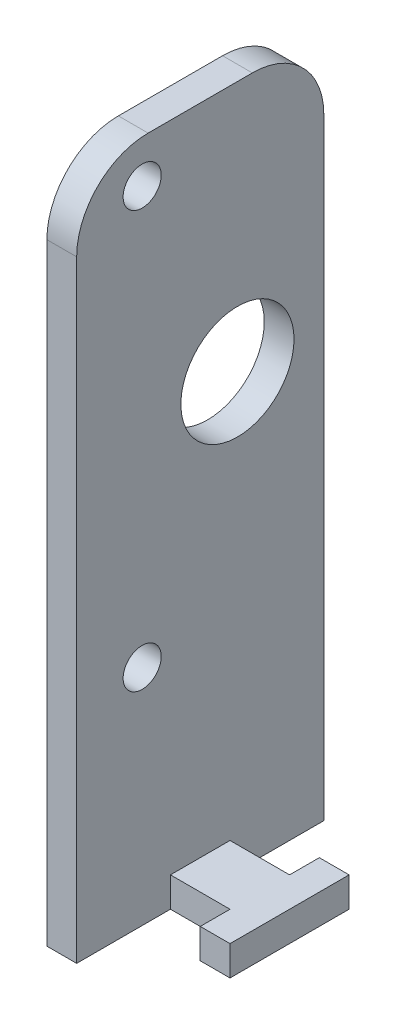
ISO-10303-21;
HEADER;
FILE_DESCRIPTION(('STEP AP214'),'2;1');
FILE_NAME('part.step','',(''),(''),'','','');
FILE_SCHEMA(('AUTOMOTIVE_DESIGN { 1 0 10303 214 1 1 1 1 }'));
ENDSEC;
DATA;
#1=APPLICATION_CONTEXT('core data for automotive mechanical design processes');
#2=APPLICATION_PROTOCOL_DEFINITION('international standard','automotive_design',2000,#1);
#3=PRODUCT_CONTEXT('',#1,'mechanical');
#4=PRODUCT('Part','Part','',(#3));
#5=PRODUCT_RELATED_PRODUCT_CATEGORY('part','',(#4));
#6=PRODUCT_DEFINITION_FORMATION('','',#4);
#7=PRODUCT_DEFINITION_CONTEXT('part definition',#1,'design');
#8=PRODUCT_DEFINITION('design','',#6,#7);
#9=PRODUCT_DEFINITION_SHAPE('','',#8);
#10=(LENGTH_UNIT() NAMED_UNIT(*) SI_UNIT(.MILLI.,.METRE.));
#11=(NAMED_UNIT(*) PLANE_ANGLE_UNIT() SI_UNIT($,.RADIAN.));
#12=(NAMED_UNIT(*) SI_UNIT($,.STERADIAN.) SOLID_ANGLE_UNIT());
#13=UNCERTAINTY_MEASURE_WITH_UNIT(LENGTH_MEASURE(1.E-05),#10,'distance_accuracy_value','');
#14=(GEOMETRIC_REPRESENTATION_CONTEXT(3) GLOBAL_UNCERTAINTY_ASSIGNED_CONTEXT((#13)) GLOBAL_UNIT_ASSIGNED_CONTEXT((#10,
#11,#12)) REPRESENTATION_CONTEXT('',''));
#15=CARTESIAN_POINT('',(0.,0.,0.));
#16=DIRECTION('',(0.,0.,1.));
#17=DIRECTION('',(1.,0.,0.));
#18=AXIS2_PLACEMENT_3D('',#15,#16,#17);
#19=CARTESIAN_POINT('',(0.,2.5,0.));
#20=DIRECTION('',(0.,-1.,0.));
#21=DIRECTION('',(0.,0.,-1.));
#22=AXIS2_PLACEMENT_3D('',#19,#20,#21);
#23=PLANE('',#22);
#24=DIRECTION('',(1.,0.,0.));
#25=VECTOR('',#24,1.);
#26=CARTESIAN_POINT('',(0.,2.5,29.625));
#27=LINE('',#26,#25);
#28=CARTESIAN_POINT('',(-24.175,2.5,29.625));
#29=VERTEX_POINT('',#28);
#30=CARTESIAN_POINT('',(-19.175,2.5,29.625));
#31=VERTEX_POINT('',#30);
#32=EDGE_CURVE('E173',#29,#31,#27,.T.);
#33=ORIENTED_EDGE('',*,*,#32,.T.);
#34=DIRECTION('',(0.,0.,1.));
#35=VECTOR('',#34,1.);
#36=CARTESIAN_POINT('',(-19.1750000000001,2.5,0.));
#37=LINE('',#36,#35);
#38=CARTESIAN_POINT('',(-19.175,2.5,32.125));
#39=VERTEX_POINT('',#38);
#40=EDGE_CURVE('E170',#31,#39,#37,.T.);
#41=ORIENTED_EDGE('',*,*,#40,.T.);
#42=DIRECTION('',(-1.,0.,0.));
#43=VECTOR('',#42,1.);
#44=CARTESIAN_POINT('',(0.,2.5,32.125));
#45=LINE('',#44,#43);
#46=CARTESIAN_POINT('',(-16.675,2.5,32.125));
#47=VERTEX_POINT('',#46);
#48=EDGE_CURVE('E163',#47,#39,#45,.T.);
#49=ORIENTED_EDGE('',*,*,#48,.F.);
#50=DIRECTION('',(0.,0.,1.));
#51=VECTOR('',#50,1.);
#52=CARTESIAN_POINT('',(-16.675,2.5,0.));
#53=LINE('',#52,#51);
#54=CARTESIAN_POINT('',(-16.675,2.5,22.125));
#55=VERTEX_POINT('',#54);
#56=EDGE_CURVE('E153',#55,#47,#53,.T.);
#57=ORIENTED_EDGE('',*,*,#56,.F.);
#58=DIRECTION('',(1.,0.,0.));
#59=VECTOR('',#58,1.);
#60=CARTESIAN_POINT('',(0.,2.5,22.125));
#61=LINE('',#60,#59);
#62=CARTESIAN_POINT('',(-19.175,2.5,22.125));
#63=VERTEX_POINT('',#62);
#64=EDGE_CURVE('E155',#63,#55,#61,.T.);
#65=ORIENTED_EDGE('',*,*,#64,.F.);
#66=DIRECTION('',(0.,0.,-1.));
#67=VECTOR('',#66,1.);
#68=CARTESIAN_POINT('',(-19.1749999999999,2.5,0.));
#69=LINE('',#68,#67);
#70=CARTESIAN_POINT('',(-19.175,2.5,24.625));
#71=VERTEX_POINT('',#70);
#72=EDGE_CURVE('E179',#71,#63,#69,.T.);
#73=ORIENTED_EDGE('',*,*,#72,.F.);
#74=DIRECTION('',(1.,0.,0.));
#75=VECTOR('',#74,1.);
#76=CARTESIAN_POINT('',(0.,2.5,24.625));
#77=LINE('',#76,#75);
#78=CARTESIAN_POINT('',(-24.175,2.5,24.625));
#79=VERTEX_POINT('',#78);
#80=EDGE_CURVE('E176',#79,#71,#77,.T.);
#81=ORIENTED_EDGE('',*,*,#80,.F.);
#82=DIRECTION('',(0.,0.,-1.));
#83=VECTOR('',#82,1.);
#84=CARTESIAN_POINT('',(-24.175,2.5,37.5));
#85=LINE('',#84,#83);
#86=EDGE_CURVE('E223',#29,#79,#85,.T.);
#87=ORIENTED_EDGE('',*,*,#86,.F.);
#88=EDGE_LOOP('',(#33,#41,#49,#57,#65,#73,#81,#87));
#89=FACE_BOUND('',#88,.T.);
#90=ADVANCED_FACE('F34',(#89),#23,.F.);
#91=CARTESIAN_POINT('',(0.,0.,0.));
#92=DIRECTION('',(0.,-1.,0.));
#93=DIRECTION('',(0.,0.,-1.));
#94=AXIS2_PLACEMENT_3D('',#91,#92,#93);
#95=PLANE('',#94);
#96=DIRECTION('',(0.,0.,1.));
#97=VECTOR('',#96,1.);
#98=CARTESIAN_POINT('',(-24.175,0.,0.));
#99=LINE('',#98,#97);
#100=CARTESIAN_POINT('',(-24.175,0.,29.625));
#101=VERTEX_POINT('',#100);
#102=CARTESIAN_POINT('',(-24.175,0.,37.5));
#103=VERTEX_POINT('',#102);
#104=EDGE_CURVE('E272',#101,#103,#99,.T.);
#105=ORIENTED_EDGE('',*,*,#104,.T.);
#106=DIRECTION('',(1.,0.,0.));
#107=VECTOR('',#106,1.);
#108=CARTESIAN_POINT('',(-40.,0.,37.5));
#109=LINE('',#108,#107);
#110=CARTESIAN_POINT('',(-26.675,0.,37.5));
#111=VERTEX_POINT('',#110);
#112=EDGE_CURVE('E231',#111,#103,#109,.T.);
#113=ORIENTED_EDGE('',*,*,#112,.F.);
#114=DIRECTION('',(0.,0.,-1.));
#115=VECTOR('',#114,1.);
#116=CARTESIAN_POINT('',(-26.675,0.,-20.));
#117=LINE('',#116,#115);
#118=CARTESIAN_POINT('',(-26.675,0.,16.75));
#119=VERTEX_POINT('',#118);
#120=EDGE_CURVE('E145',#111,#119,#117,.T.);
#121=ORIENTED_EDGE('',*,*,#120,.T.);
#122=DIRECTION('',(1.,0.,0.));
#123=VECTOR('',#122,1.);
#124=CARTESIAN_POINT('',(0.,0.,16.75));
#125=LINE('',#124,#123);
#126=CARTESIAN_POINT('',(-24.175,0.,16.75));
#127=VERTEX_POINT('',#126);
#128=EDGE_CURVE('E258',#119,#127,#125,.T.);
#129=ORIENTED_EDGE('',*,*,#128,.T.);
#130=DIRECTION('',(0.,0.,1.));
#131=VECTOR('',#130,1.);
#132=CARTESIAN_POINT('',(-24.175,0.,0.));
#133=LINE('',#132,#131);
#134=CARTESIAN_POINT('',(-24.175,0.,24.625));
#135=VERTEX_POINT('',#134);
#136=EDGE_CURVE('E276',#127,#135,#133,.T.);
#137=ORIENTED_EDGE('',*,*,#136,.T.);
#138=DIRECTION('',(1.,0.,0.));
#139=VECTOR('',#138,1.);
#140=CARTESIAN_POINT('',(0.,0.,24.625));
#141=LINE('',#140,#139);
#142=CARTESIAN_POINT('',(-19.175,0.,24.625));
#143=VERTEX_POINT('',#142);
#144=EDGE_CURVE('E284',#135,#143,#141,.T.);
#145=ORIENTED_EDGE('',*,*,#144,.T.);
#146=DIRECTION('',(0.,0.,-1.));
#147=VECTOR('',#146,1.);
#148=CARTESIAN_POINT('',(-19.1749999999999,0.,0.));
#149=LINE('',#148,#147);
#150=CARTESIAN_POINT('',(-19.175,0.,22.125));
#151=VERTEX_POINT('',#150);
#152=EDGE_CURVE('E165',#143,#151,#149,.T.);
#153=ORIENTED_EDGE('',*,*,#152,.T.);
#154=DIRECTION('',(1.,0.,0.));
#155=VECTOR('',#154,1.);
#156=CARTESIAN_POINT('',(0.,0.,22.125));
#157=LINE('',#156,#155);
#158=CARTESIAN_POINT('',(-16.675,0.,22.125));
#159=VERTEX_POINT('',#158);
#160=EDGE_CURVE('E161',#151,#159,#157,.T.);
#161=ORIENTED_EDGE('',*,*,#160,.T.);
#162=DIRECTION('',(0.,0.,1.));
#163=VECTOR('',#162,1.);
#164=CARTESIAN_POINT('',(-16.675,0.,0.));
#165=LINE('',#164,#163);
#166=CARTESIAN_POINT('',(-16.675,0.,32.125));
#167=VERTEX_POINT('',#166);
#168=EDGE_CURVE('E150',#159,#167,#165,.T.);
#169=ORIENTED_EDGE('',*,*,#168,.T.);
#170=DIRECTION('',(-1.,0.,0.));
#171=VECTOR('',#170,1.);
#172=CARTESIAN_POINT('',(0.,0.,32.125));
#173=LINE('',#172,#171);
#174=CARTESIAN_POINT('',(-19.175,0.,32.125));
#175=VERTEX_POINT('',#174);
#176=EDGE_CURVE('E135',#167,#175,#173,.T.);
#177=ORIENTED_EDGE('',*,*,#176,.T.);
#178=DIRECTION('',(0.,0.,1.));
#179=VECTOR('',#178,1.);
#180=CARTESIAN_POINT('',(-19.1750000000001,0.,0.));
#181=LINE('',#180,#179);
#182=CARTESIAN_POINT('',(-19.175,0.,29.625));
#183=VERTEX_POINT('',#182);
#184=EDGE_CURVE('E278',#183,#175,#181,.T.);
#185=ORIENTED_EDGE('',*,*,#184,.F.);
#186=DIRECTION('',(1.,0.,0.));
#187=VECTOR('',#186,1.);
#188=CARTESIAN_POINT('',(0.,0.,29.625));
#189=LINE('',#188,#187);
#190=EDGE_CURVE('E273',#101,#183,#189,.T.);
#191=ORIENTED_EDGE('',*,*,#190,.F.);
#192=EDGE_LOOP('',(#105,#113,#121,#129,#137,#145,#153,#161,#169,#177,#185,#191));
#193=FACE_BOUND('',#192,.T.);
#194=ADVANCED_FACE('F159',(#193),#95,.T.);
#195=CARTESIAN_POINT('',(0.,0.,37.5));
#196=DIRECTION('',(0.,0.,1.));
#197=DIRECTION('',(1.,0.,0.));
#198=AXIS2_PLACEMENT_3D('',#195,#196,#197);
#199=PLANE('',#198);
#200=ORIENTED_EDGE('',*,*,#112,.T.);
#201=DIRECTION('',(0.,-1.,0.));
#202=VECTOR('',#201,1.);
#203=CARTESIAN_POINT('',(-24.175,97.9000598085269,37.5));
#204=LINE('',#203,#202);
#205=CARTESIAN_POINT('',(-24.175,51.375,37.5));
#206=VERTEX_POINT('',#205);
#207=EDGE_CURVE('E227',#206,#103,#204,.T.);
#208=ORIENTED_EDGE('',*,*,#207,.F.);
#209=DIRECTION('',(1.,0.,0.));
#210=VECTOR('',#209,1.);
#211=CARTESIAN_POINT('',(-26.675,51.375,37.5));
#212=LINE('',#211,#210);
#213=CARTESIAN_POINT('',(-26.675,51.375,37.5));
#214=VERTEX_POINT('',#213);
#215=EDGE_CURVE('E11',#206,#214,#212,.F.);
#216=ORIENTED_EDGE('',*,*,#215,.T.);
#217=DIRECTION('',(0.,-1.,0.));
#218=VECTOR('',#217,1.);
#219=CARTESIAN_POINT('',(-26.675,97.9000598085269,37.5));
#220=LINE('',#219,#218);
#221=EDGE_CURVE('E212',#214,#111,#220,.T.);
#222=ORIENTED_EDGE('',*,*,#221,.T.);
#223=EDGE_LOOP('',(#200,#208,#216,#222));
#224=FACE_BOUND('',#223,.T.);
#225=ADVANCED_FACE('F269',(#224),#199,.T.);
#226=CARTESIAN_POINT('',(-24.175,97.9000598085269,37.5));
#227=DIRECTION('',(-1.,0.,0.));
#228=DIRECTION('',(0.,0.,1.));
#229=AXIS2_PLACEMENT_3D('',#226,#227,#228);
#230=PLANE('',#229);
#231=CARTESIAN_POINT('',(-24.175,36.275,24.));
#232=DIRECTION('',(1.,0.,0.));
#233=DIRECTION('',(0.,0.,-1.));
#234=AXIS2_PLACEMENT_3D('',#231,#232,#233);
#235=CIRCLE('',#234,4.75);
#236=CARTESIAN_POINT('',(-24.175,36.275,19.25));
#237=VERTEX_POINT('',#236);
#238=EDGE_CURVE('E205',#237,#237,#235,.T.);
#239=ORIENTED_EDGE('',*,*,#238,.F.);
#240=EDGE_LOOP('',(#239));
#241=FACE_BOUND('',#240,.T.);
#242=CARTESIAN_POINT('',(-24.175,18.775,32.));
#243=DIRECTION('',(1.,0.,0.));
#244=DIRECTION('',(0.,0.,-1.));
#245=AXIS2_PLACEMENT_3D('',#242,#243,#244);
#246=CIRCLE('',#245,1.6);
#247=CARTESIAN_POINT('',(-24.175,18.775,30.4));
#248=VERTEX_POINT('',#247);
#249=EDGE_CURVE('E209',#248,#248,#246,.T.);
#250=ORIENTED_EDGE('',*,*,#249,.F.);
#251=EDGE_LOOP('',(#250));
#252=FACE_BOUND('',#251,.T.);
#253=CARTESIAN_POINT('',(-24.175,53.775,32.));
#254=DIRECTION('',(1.,0.,0.));
#255=DIRECTION('',(0.,0.,-1.));
#256=AXIS2_PLACEMENT_3D('',#253,#254,#255);
#257=CIRCLE('',#256,1.6);
#258=CARTESIAN_POINT('',(-24.175,53.775,30.4));
#259=VERTEX_POINT('',#258);
#260=EDGE_CURVE('E216',#259,#259,#257,.T.);
#261=ORIENTED_EDGE('',*,*,#260,.F.);
#262=EDGE_LOOP('',(#261));
#263=FACE_BOUND('',#262,.T.);
#264=DIRECTION('',(0.,-1.,0.));
#265=VECTOR('',#264,1.);
#266=CARTESIAN_POINT('',(-24.175,97.9000598085269,16.75));
#267=LINE('',#266,#265);
#268=CARTESIAN_POINT('',(-24.175,51.375,16.75));
#269=VERTEX_POINT('',#268);
#270=EDGE_CURVE('E226',#269,#127,#267,.T.);
#271=ORIENTED_EDGE('',*,*,#270,.F.);
#272=CARTESIAN_POINT('',(-24.175,51.375,22.75));
#273=DIRECTION('',(-1.,0.,0.));
#274=DIRECTION('',(0.,0.,1.));
#275=AXIS2_PLACEMENT_3D('',#272,#273,#274);
#276=CIRCLE('',#275,6.);
#277=CARTESIAN_POINT('',(-24.175,57.375,22.75));
#278=VERTEX_POINT('',#277);
#279=EDGE_CURVE('E240',#269,#278,#276,.F.);
#280=ORIENTED_EDGE('',*,*,#279,.T.);
#281=DIRECTION('',(0.,0.,-1.));
#282=VECTOR('',#281,1.);
#283=CARTESIAN_POINT('',(-24.175,57.375,37.5));
#284=LINE('',#283,#282);
#285=CARTESIAN_POINT('',(-24.175,57.375,31.5));
#286=VERTEX_POINT('',#285);
#287=EDGE_CURVE('E198',#286,#278,#284,.T.);
#288=ORIENTED_EDGE('',*,*,#287,.F.);
#289=CARTESIAN_POINT('',(-24.175,51.375,31.5));
#290=DIRECTION('',(-1.,0.,0.));
#291=DIRECTION('',(0.,0.,1.));
#292=AXIS2_PLACEMENT_3D('',#289,#290,#291);
#293=CIRCLE('',#292,6.);
#294=EDGE_CURVE('E238',#286,#206,#293,.F.);
#295=ORIENTED_EDGE('',*,*,#294,.T.);
#296=ORIENTED_EDGE('',*,*,#207,.T.);
#297=ORIENTED_EDGE('',*,*,#104,.F.);
#298=DIRECTION('',(0.,1.,0.));
#299=VECTOR('',#298,1.);
#300=CARTESIAN_POINT('',(-24.175,-97.6291964527006,29.625));
#301=LINE('',#300,#299);
#302=EDGE_CURVE('E191',#101,#29,#301,.T.);
#303=ORIENTED_EDGE('',*,*,#302,.T.);
#304=ORIENTED_EDGE('',*,*,#86,.T.);
#305=DIRECTION('',(0.,1.,0.));
#306=VECTOR('',#305,1.);
#307=CARTESIAN_POINT('',(-24.175,-97.6291964527006,24.625));
#308=LINE('',#307,#306);
#309=EDGE_CURVE('E189',#135,#79,#308,.T.);
#310=ORIENTED_EDGE('',*,*,#309,.F.);
#311=ORIENTED_EDGE('',*,*,#136,.F.);
#312=EDGE_LOOP('',(#271,#280,#288,#295,#296,#297,#303,#304,#310,#311));
#313=FACE_BOUND('',#312,.T.);
#314=ADVANCED_FACE('F262',(#241,#252,#263,#313),#230,.F.);
#315=CARTESIAN_POINT('',(-24.175,97.9000598085269,16.75));
#316=DIRECTION('',(0.,0.,1.));
#317=DIRECTION('',(1.,0.,0.));
#318=AXIS2_PLACEMENT_3D('',#315,#316,#317);
#319=PLANE('',#318);
#320=DIRECTION('',(0.,-1.,0.));
#321=VECTOR('',#320,1.);
#322=CARTESIAN_POINT('',(-26.675,97.9000598085269,16.75));
#323=LINE('',#322,#321);
#324=CARTESIAN_POINT('',(-26.675,51.375,16.75));
#325=VERTEX_POINT('',#324);
#326=EDGE_CURVE('E49',#325,#119,#323,.T.);
#327=ORIENTED_EDGE('',*,*,#326,.F.);
#328=DIRECTION('',(1.,0.,0.));
#329=VECTOR('',#328,1.);
#330=CARTESIAN_POINT('',(-24.175,51.375,16.75));
#331=LINE('',#330,#329);
#332=EDGE_CURVE('E235',#325,#269,#331,.T.);
#333=ORIENTED_EDGE('',*,*,#332,.T.);
#334=ORIENTED_EDGE('',*,*,#270,.T.);
#335=ORIENTED_EDGE('',*,*,#128,.F.);
#336=EDGE_LOOP('',(#327,#333,#334,#335));
#337=FACE_BOUND('',#336,.T.);
#338=ADVANCED_FACE('F255',(#337),#319,.F.);
#339=CARTESIAN_POINT('',(-26.675,97.9000598085269,16.75));
#340=DIRECTION('',(1.,0.,0.));
#341=DIRECTION('',(0.,0.,-1.));
#342=AXIS2_PLACEMENT_3D('',#339,#340,#341);
#343=PLANE('',#342);
#344=CARTESIAN_POINT('',(-26.675,36.275,24.));
#345=DIRECTION('',(1.,0.,0.));
#346=DIRECTION('',(0.,0.,-1.));
#347=AXIS2_PLACEMENT_3D('',#344,#345,#346);
#348=CIRCLE('',#347,4.75);
#349=CARTESIAN_POINT('',(-26.675,36.275,19.25));
#350=VERTEX_POINT('',#349);
#351=EDGE_CURVE('E208',#350,#350,#348,.F.);
#352=ORIENTED_EDGE('',*,*,#351,.F.);
#353=EDGE_LOOP('',(#352));
#354=FACE_BOUND('',#353,.T.);
#355=CARTESIAN_POINT('',(-26.675,18.775,32.));
#356=DIRECTION('',(1.,0.,0.));
#357=DIRECTION('',(0.,0.,-1.));
#358=AXIS2_PLACEMENT_3D('',#355,#356,#357);
#359=CIRCLE('',#358,1.6);
#360=CARTESIAN_POINT('',(-26.675,18.775,30.4));
#361=VERTEX_POINT('',#360);
#362=EDGE_CURVE('E213',#361,#361,#359,.F.);
#363=ORIENTED_EDGE('',*,*,#362,.F.);
#364=EDGE_LOOP('',(#363));
#365=FACE_BOUND('',#364,.T.);
#366=CARTESIAN_POINT('',(-26.675,53.775,32.));
#367=DIRECTION('',(1.,0.,0.));
#368=DIRECTION('',(0.,0.,-1.));
#369=AXIS2_PLACEMENT_3D('',#366,#367,#368);
#370=CIRCLE('',#369,1.6);
#371=CARTESIAN_POINT('',(-26.675,53.775,30.4));
#372=VERTEX_POINT('',#371);
#373=EDGE_CURVE('E202',#372,#372,#370,.F.);
#374=ORIENTED_EDGE('',*,*,#373,.F.);
#375=EDGE_LOOP('',(#374));
#376=FACE_BOUND('',#375,.T.);
#377=ORIENTED_EDGE('',*,*,#326,.T.);
#378=ORIENTED_EDGE('',*,*,#120,.F.);
#379=ORIENTED_EDGE('',*,*,#221,.F.);
#380=CARTESIAN_POINT('',(-26.675,51.375,31.5));
#381=DIRECTION('',(1.,0.,0.));
#382=DIRECTION('',(0.,0.,-1.));
#383=AXIS2_PLACEMENT_3D('',#380,#381,#382);
#384=CIRCLE('',#383,6.);
#385=CARTESIAN_POINT('',(-26.675,57.375,31.5));
#386=VERTEX_POINT('',#385);
#387=EDGE_CURVE('E247',#214,#386,#384,.F.);
#388=ORIENTED_EDGE('',*,*,#387,.T.);
#389=DIRECTION('',(0.,0.,1.));
#390=VECTOR('',#389,1.);
#391=CARTESIAN_POINT('',(-26.675,57.375,37.5));
#392=LINE('',#391,#390);
#393=CARTESIAN_POINT('',(-26.675,57.375,22.75));
#394=VERTEX_POINT('',#393);
#395=EDGE_CURVE('E199',#394,#386,#392,.T.);
#396=ORIENTED_EDGE('',*,*,#395,.F.);
#397=CARTESIAN_POINT('',(-26.675,51.375,22.75));
#398=DIRECTION('',(1.,0.,0.));
#399=DIRECTION('',(0.,0.,-1.));
#400=AXIS2_PLACEMENT_3D('',#397,#398,#399);
#401=CIRCLE('',#400,6.);
#402=EDGE_CURVE('E42',#394,#325,#401,.F.);
#403=ORIENTED_EDGE('',*,*,#402,.T.);
#404=EDGE_LOOP('',(#377,#378,#379,#388,#396,#403));
#405=FACE_BOUND('',#404,.T.);
#406=ADVANCED_FACE('F250',(#354,#365,#376,#405),#343,.F.);
#407=CARTESIAN_POINT('',(-40.1100288425444,53.775,32.));
#408=DIRECTION('',(1.,0.,0.));
#409=DIRECTION('',(0.,0.,-1.));
#410=AXIS2_PLACEMENT_3D('',#407,#408,#409);
#411=CYLINDRICAL_SURFACE('',#410,1.6);
#412=ORIENTED_EDGE('',*,*,#373,.T.);
#413=EDGE_LOOP('',(#412));
#414=FACE_BOUND('',#413,.T.);
#415=ORIENTED_EDGE('',*,*,#260,.T.);
#416=EDGE_LOOP('',(#415));
#417=FACE_BOUND('',#416,.T.);
#418=ADVANCED_FACE('F333',(#414,#417),#411,.F.);
#419=CARTESIAN_POINT('',(-40.1100288425444,18.775,32.));
#420=DIRECTION('',(1.,0.,0.));
#421=DIRECTION('',(0.,0.,-1.));
#422=AXIS2_PLACEMENT_3D('',#419,#420,#421);
#423=CYLINDRICAL_SURFACE('',#422,1.6);
#424=ORIENTED_EDGE('',*,*,#362,.T.);
#425=EDGE_LOOP('',(#424));
#426=FACE_BOUND('',#425,.T.);
#427=ORIENTED_EDGE('',*,*,#249,.T.);
#428=EDGE_LOOP('',(#427));
#429=FACE_BOUND('',#428,.T.);
#430=ADVANCED_FACE('F326',(#426,#429),#423,.F.);
#431=CARTESIAN_POINT('',(-40.1100288425444,36.275,24.));
#432=DIRECTION('',(1.,0.,0.));
#433=DIRECTION('',(0.,0.,-1.));
#434=AXIS2_PLACEMENT_3D('',#431,#432,#433);
#435=CYLINDRICAL_SURFACE('',#434,4.75);
#436=ORIENTED_EDGE('',*,*,#351,.T.);
#437=EDGE_LOOP('',(#436));
#438=FACE_BOUND('',#437,.T.);
#439=ORIENTED_EDGE('',*,*,#238,.T.);
#440=EDGE_LOOP('',(#439));
#441=FACE_BOUND('',#440,.T.);
#442=ADVANCED_FACE('F321',(#438,#441),#435,.F.);
#443=CARTESIAN_POINT('',(-55.2355168895803,57.375,37.5));
#444=DIRECTION('',(0.,-1.,0.));
#445=DIRECTION('',(0.,0.,-1.));
#446=AXIS2_PLACEMENT_3D('',#443,#444,#445);
#447=PLANE('',#446);
#448=ORIENTED_EDGE('',*,*,#287,.T.);
#449=DIRECTION('',(1.,0.,0.));
#450=VECTOR('',#449,1.);
#451=CARTESIAN_POINT('',(-55.2355168895803,57.375,22.75));
#452=LINE('',#451,#450);
#453=EDGE_CURVE('E245',#278,#394,#452,.F.);
#454=ORIENTED_EDGE('',*,*,#453,.T.);
#455=ORIENTED_EDGE('',*,*,#395,.T.);
#456=DIRECTION('',(1.,0.,0.));
#457=VECTOR('',#456,1.);
#458=CARTESIAN_POINT('',(-24.175,57.375,31.5));
#459=LINE('',#458,#457);
#460=EDGE_CURVE('E242',#386,#286,#459,.T.);
#461=ORIENTED_EDGE('',*,*,#460,.T.);
#462=EDGE_LOOP('',(#448,#454,#455,#461));
#463=FACE_BOUND('',#462,.T.);
#464=ADVANCED_FACE('F265',(#463),#447,.F.);
#465=CARTESIAN_POINT('',(-24.175,51.375,22.75));
#466=DIRECTION('',(1.,0.,0.));
#467=DIRECTION('',(0.,0.,-1.));
#468=AXIS2_PLACEMENT_3D('',#465,#466,#467);
#469=CYLINDRICAL_SURFACE('',#468,6.);
#470=ORIENTED_EDGE('',*,*,#402,.F.);
#471=ORIENTED_EDGE('',*,*,#453,.F.);
#472=ORIENTED_EDGE('',*,*,#279,.F.);
#473=ORIENTED_EDGE('',*,*,#332,.F.);
#474=EDGE_LOOP('',(#470,#471,#472,#473));
#475=FACE_BOUND('',#474,.T.);
#476=ADVANCED_FACE('F259',(#475),#469,.T.);
#477=CARTESIAN_POINT('',(-55.2355168895803,51.375,31.5));
#478=DIRECTION('',(-1.,0.,0.));
#479=DIRECTION('',(0.,0.,1.));
#480=AXIS2_PLACEMENT_3D('',#477,#478,#479);
#481=CYLINDRICAL_SURFACE('',#480,6.);
#482=ORIENTED_EDGE('',*,*,#387,.F.);
#483=ORIENTED_EDGE('',*,*,#215,.F.);
#484=ORIENTED_EDGE('',*,*,#294,.F.);
#485=ORIENTED_EDGE('',*,*,#460,.F.);
#486=EDGE_LOOP('',(#482,#483,#484,#485));
#487=FACE_BOUND('',#486,.T.);
#488=ADVANCED_FACE('F36',(#487),#481,.T.);
#489=CARTESIAN_POINT('',(0.,-97.6291964527006,32.125));
#490=DIRECTION('',(0.,0.,-1.));
#491=DIRECTION('',(-1.,0.,0.));
#492=AXIS2_PLACEMENT_3D('',#489,#490,#491);
#493=PLANE('',#492);
#494=DIRECTION('',(0.,1.,0.));
#495=VECTOR('',#494,1.);
#496=CARTESIAN_POINT('',(-16.675,-97.6291964527006,32.125));
#497=LINE('',#496,#495);
#498=EDGE_CURVE('E139',#167,#47,#497,.T.);
#499=ORIENTED_EDGE('',*,*,#498,.T.);
#500=ORIENTED_EDGE('',*,*,#48,.T.);
#501=DIRECTION('',(0.,1.,0.));
#502=VECTOR('',#501,1.);
#503=CARTESIAN_POINT('',(-19.175,-97.6291964527006,32.125));
#504=LINE('',#503,#502);
#505=EDGE_CURVE('E141',#175,#39,#504,.T.);
#506=ORIENTED_EDGE('',*,*,#505,.F.);
#507=ORIENTED_EDGE('',*,*,#176,.F.);
#508=EDGE_LOOP('',(#499,#500,#506,#507));
#509=FACE_BOUND('',#508,.T.);
#510=ADVANCED_FACE('F137',(#509),#493,.F.);
#511=CARTESIAN_POINT('',(-19.1750000000001,-97.6291964527006,0.));
#512=DIRECTION('',(-1.,0.,0.));
#513=DIRECTION('',(0.,0.,1.));
#514=AXIS2_PLACEMENT_3D('',#511,#512,#513);
#515=PLANE('',#514);
#516=ORIENTED_EDGE('',*,*,#184,.T.);
#517=ORIENTED_EDGE('',*,*,#505,.T.);
#518=ORIENTED_EDGE('',*,*,#40,.F.);
#519=DIRECTION('',(0.,1.,0.));
#520=VECTOR('',#519,1.);
#521=CARTESIAN_POINT('',(-19.175,-97.6291964527006,29.625));
#522=LINE('',#521,#520);
#523=EDGE_CURVE('E193',#183,#31,#522,.T.);
#524=ORIENTED_EDGE('',*,*,#523,.F.);
#525=EDGE_LOOP('',(#516,#517,#518,#524));
#526=FACE_BOUND('',#525,.T.);
#527=ADVANCED_FACE('F482',(#526),#515,.T.);
#528=CARTESIAN_POINT('',(0.,-97.6291964527006,29.625));
#529=DIRECTION('',(0.,0.,1.));
#530=DIRECTION('',(1.,0.,0.));
#531=AXIS2_PLACEMENT_3D('',#528,#529,#530);
#532=PLANE('',#531);
#533=ORIENTED_EDGE('',*,*,#190,.T.);
#534=ORIENTED_EDGE('',*,*,#523,.T.);
#535=ORIENTED_EDGE('',*,*,#32,.F.);
#536=ORIENTED_EDGE('',*,*,#302,.F.);
#537=EDGE_LOOP('',(#533,#534,#535,#536));
#538=FACE_BOUND('',#537,.T.);
#539=ADVANCED_FACE('F489',(#538),#532,.T.);
#540=CARTESIAN_POINT('',(0.,-97.6291964527006,24.625));
#541=DIRECTION('',(0.,0.,1.));
#542=DIRECTION('',(1.,0.,0.));
#543=AXIS2_PLACEMENT_3D('',#540,#541,#542);
#544=PLANE('',#543);
#545=ORIENTED_EDGE('',*,*,#309,.T.);
#546=ORIENTED_EDGE('',*,*,#80,.T.);
#547=DIRECTION('',(0.,1.,0.));
#548=VECTOR('',#547,1.);
#549=CARTESIAN_POINT('',(-19.175,-97.6291964527006,24.625));
#550=LINE('',#549,#548);
#551=EDGE_CURVE('E187',#143,#71,#550,.T.);
#552=ORIENTED_EDGE('',*,*,#551,.F.);
#553=ORIENTED_EDGE('',*,*,#144,.F.);
#554=EDGE_LOOP('',(#545,#546,#552,#553));
#555=FACE_BOUND('',#554,.T.);
#556=ADVANCED_FACE('F291',(#555),#544,.F.);
#557=CARTESIAN_POINT('',(-19.1749999999999,-97.6291964527006,0.));
#558=DIRECTION('',(1.,0.,0.));
#559=DIRECTION('',(0.,0.,-1.));
#560=AXIS2_PLACEMENT_3D('',#557,#558,#559);
#561=PLANE('',#560);
#562=ORIENTED_EDGE('',*,*,#551,.T.);
#563=ORIENTED_EDGE('',*,*,#72,.T.);
#564=DIRECTION('',(0.,1.,0.));
#565=VECTOR('',#564,1.);
#566=CARTESIAN_POINT('',(-19.175,-97.6291964527006,22.125));
#567=LINE('',#566,#565);
#568=EDGE_CURVE('E185',#151,#63,#567,.T.);
#569=ORIENTED_EDGE('',*,*,#568,.F.);
#570=ORIENTED_EDGE('',*,*,#152,.F.);
#571=EDGE_LOOP('',(#562,#563,#569,#570));
#572=FACE_BOUND('',#571,.T.);
#573=ADVANCED_FACE('F289',(#572),#561,.F.);
#574=CARTESIAN_POINT('',(0.,-97.6291964527006,22.125));
#575=DIRECTION('',(0.,0.,1.));
#576=DIRECTION('',(1.,0.,0.));
#577=AXIS2_PLACEMENT_3D('',#574,#575,#576);
#578=PLANE('',#577);
#579=ORIENTED_EDGE('',*,*,#568,.T.);
#580=ORIENTED_EDGE('',*,*,#64,.T.);
#581=DIRECTION('',(0.,1.,0.));
#582=VECTOR('',#581,1.);
#583=CARTESIAN_POINT('',(-16.675,-97.6291964527006,22.125));
#584=LINE('',#583,#582);
#585=EDGE_CURVE('E146',#159,#55,#584,.T.);
#586=ORIENTED_EDGE('',*,*,#585,.F.);
#587=ORIENTED_EDGE('',*,*,#160,.F.);
#588=EDGE_LOOP('',(#579,#580,#586,#587));
#589=FACE_BOUND('',#588,.T.);
#590=ADVANCED_FACE('F299',(#589),#578,.F.);
#591=CARTESIAN_POINT('',(-16.675,-97.6291964527006,0.));
#592=DIRECTION('',(-1.,0.,0.));
#593=DIRECTION('',(0.,0.,1.));
#594=AXIS2_PLACEMENT_3D('',#591,#592,#593);
#595=PLANE('',#594);
#596=ORIENTED_EDGE('',*,*,#585,.T.);
#597=ORIENTED_EDGE('',*,*,#56,.T.);
#598=ORIENTED_EDGE('',*,*,#498,.F.);
#599=ORIENTED_EDGE('',*,*,#168,.F.);
#600=EDGE_LOOP('',(#596,#597,#598,#599));
#601=FACE_BOUND('',#600,.T.);
#602=ADVANCED_FACE('F149',(#601),#595,.F.);
#603=CLOSED_SHELL('',(#90,#194,#225,#314,#338,#406,#418,#430,#442,#464,#476,#488,#510,#527,#539,
#556,#573,#590,#602));
#604=MANIFOLD_SOLID_BREP('B2',#603);
#605=ADVANCED_BREP_SHAPE_REPRESENTATION('',(#18,#604),#14);
#606=SHAPE_DEFINITION_REPRESENTATION(#9,#605);
ENDSEC;
END-ISO-10303-21;
